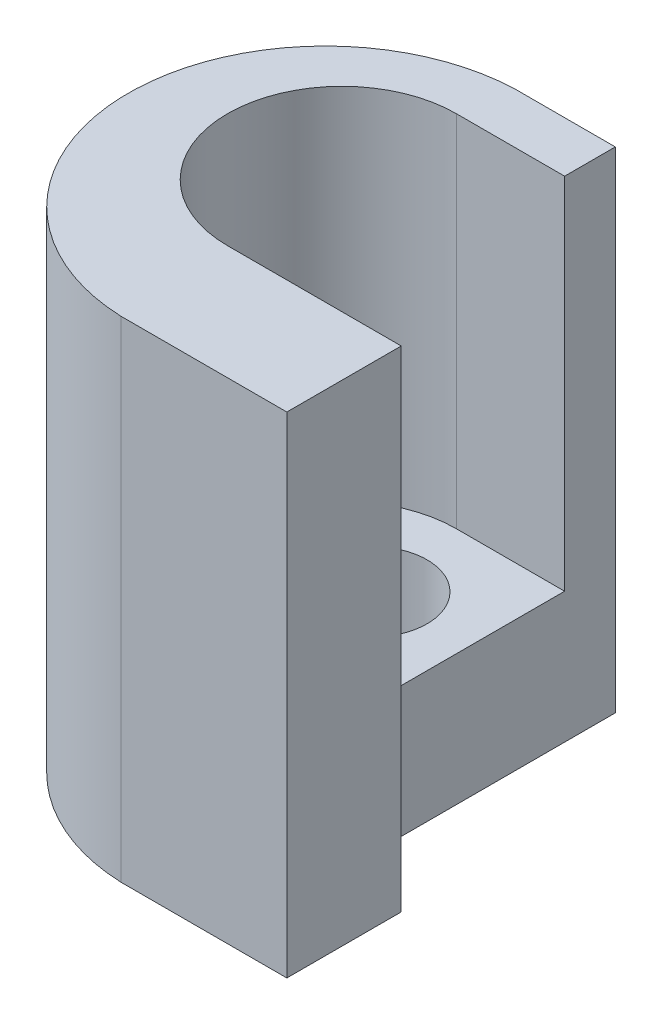
ISO-10303-21;
HEADER;
FILE_DESCRIPTION(('STEP AP214'),'2;1');
FILE_NAME('part.step','',(''),(''),'','','');
FILE_SCHEMA(('AUTOMOTIVE_DESIGN { 1 0 10303 214 1 1 1 1 }'));
ENDSEC;
DATA;
#1=APPLICATION_CONTEXT('core data for automotive mechanical design processes');
#2=APPLICATION_PROTOCOL_DEFINITION('international standard','automotive_design',2000,#1);
#3=PRODUCT_CONTEXT('',#1,'mechanical');
#4=PRODUCT('Part','Part','',(#3));
#5=PRODUCT_RELATED_PRODUCT_CATEGORY('part','',(#4));
#6=PRODUCT_DEFINITION_FORMATION('','',#4);
#7=PRODUCT_DEFINITION_CONTEXT('part definition',#1,'design');
#8=PRODUCT_DEFINITION('design','',#6,#7);
#9=PRODUCT_DEFINITION_SHAPE('','',#8);
#10=(LENGTH_UNIT() NAMED_UNIT(*) SI_UNIT(.MILLI.,.METRE.));
#11=(NAMED_UNIT(*) PLANE_ANGLE_UNIT() SI_UNIT($,.RADIAN.));
#12=(NAMED_UNIT(*) SI_UNIT($,.STERADIAN.) SOLID_ANGLE_UNIT());
#13=UNCERTAINTY_MEASURE_WITH_UNIT(LENGTH_MEASURE(1.E-05),#10,'distance_accuracy_value','');
#14=(GEOMETRIC_REPRESENTATION_CONTEXT(3) GLOBAL_UNCERTAINTY_ASSIGNED_CONTEXT((#13)) GLOBAL_UNIT_ASSIGNED_CONTEXT((#10,
#11,#12)) REPRESENTATION_CONTEXT('',''));
#15=CARTESIAN_POINT('',(0.,0.,0.));
#16=DIRECTION('',(0.,0.,1.));
#17=DIRECTION('',(1.,0.,0.));
#18=AXIS2_PLACEMENT_3D('',#15,#16,#17);
#19=CARTESIAN_POINT('',(-14.338233670593,4.,0.53336368));
#20=DIRECTION('',(0.,-1.,0.));
#21=DIRECTION('',(0.,0.,-1.));
#22=AXIS2_PLACEMENT_3D('',#19,#20,#21);
#23=PLANE('',#22);
#24=DIRECTION('',(-1.,0.,0.));
#25=VECTOR('',#24,1.);
#26=CARTESIAN_POINT('',(-14.338233670593,4.,-2.96663632));
#27=LINE('',#26,#25);
#28=CARTESIAN_POINT('',(-11.0234775688937,4.,-2.96663632));
#29=VERTEX_POINT('',#28);
#30=CARTESIAN_POINT('',(-14.338233670593,4.,-2.96663632));
#31=VERTEX_POINT('',#30);
#32=EDGE_CURVE('E148',#29,#31,#27,.T.);
#33=ORIENTED_EDGE('',*,*,#32,.T.);
#34=CARTESIAN_POINT('',(-14.338233670593,4.,0.53336368));
#35=DIRECTION('',(0.,1.,0.));
#36=DIRECTION('',(0.,0.,-1.));
#37=AXIS2_PLACEMENT_3D('',#34,#35,#36);
#38=CIRCLE('',#37,3.5);
#39=CARTESIAN_POINT('',(-14.338233670593,4.,4.03336368));
#40=VERTEX_POINT('',#39);
#41=EDGE_CURVE('E62',#31,#40,#38,.T.);
#42=ORIENTED_EDGE('',*,*,#41,.T.);
#43=DIRECTION('',(1.,0.,0.));
#44=VECTOR('',#43,1.);
#45=CARTESIAN_POINT('',(-11.0234775688937,4.,4.03336368));
#46=LINE('',#45,#44);
#47=CARTESIAN_POINT('',(-11.0234775688937,4.,4.03336368));
#48=VERTEX_POINT('',#47);
#49=EDGE_CURVE('E153',#40,#48,#46,.T.);
#50=ORIENTED_EDGE('',*,*,#49,.T.);
#51=DIRECTION('',(0.,0.,-1.));
#52=VECTOR('',#51,1.);
#53=CARTESIAN_POINT('',(-11.0234775688937,4.,-2.96663632));
#54=LINE('',#53,#52);
#55=EDGE_CURVE('E48',#48,#29,#54,.T.);
#56=ORIENTED_EDGE('',*,*,#55,.T.);
#57=EDGE_LOOP('',(#33,#42,#50,#56));
#58=FACE_BOUND('',#57,.T.);
#59=CARTESIAN_POINT('',(-13.9634775688937,4.,0.00336367999999949));
#60=DIRECTION('',(0.,1.,0.));
#61=DIRECTION('',(0.,0.,1.));
#62=AXIS2_PLACEMENT_3D('',#59,#60,#61);
#63=CIRCLE('',#62,1.7);
#64=CARTESIAN_POINT('',(-13.9634775688937,4.,1.70336368));
#65=VERTEX_POINT('',#64);
#66=EDGE_CURVE('E138',#65,#65,#63,.T.);
#67=ORIENTED_EDGE('',*,*,#66,.F.);
#68=EDGE_LOOP('',(#67));
#69=FACE_BOUND('',#68,.T.);
#70=ADVANCED_FACE('F39',(#58,#69),#23,.F.);
#71=CARTESIAN_POINT('',(-14.338233670593,0.,0.53336368));
#72=DIRECTION('',(0.,-1.,0.));
#73=DIRECTION('',(0.,0.,-1.));
#74=AXIS2_PLACEMENT_3D('',#71,#72,#73);
#75=PLANE('',#74);
#76=DIRECTION('',(-1.,0.,0.));
#77=VECTOR('',#76,1.);
#78=CARTESIAN_POINT('',(-11.0234775688937,0.,-4.51757177830843));
#79=LINE('',#78,#77);
#80=CARTESIAN_POINT('',(-11.0234775688937,0.,-4.51757177830843));
#81=VERTEX_POINT('',#80);
#82=CARTESIAN_POINT('',(-14.1034775688937,0.,-4.51757177830843));
#83=VERTEX_POINT('',#82);
#84=EDGE_CURVE('E171',#81,#83,#79,.T.);
#85=ORIENTED_EDGE('',*,*,#84,.F.);
#86=DIRECTION('',(0.,0.,-1.));
#87=VECTOR('',#86,1.);
#88=CARTESIAN_POINT('',(-11.0234775688937,0.,-2.96663632));
#89=LINE('',#88,#87);
#90=CARTESIAN_POINT('',(-11.0234775688937,0.,4.03336368));
#91=VERTEX_POINT('',#90);
#92=EDGE_CURVE('E146',#91,#81,#89,.T.);
#93=ORIENTED_EDGE('',*,*,#92,.F.);
#94=DIRECTION('',(-1.,0.,0.));
#95=VECTOR('',#94,1.);
#96=CARTESIAN_POINT('',(-14.338233670593,0.,4.03336368));
#97=LINE('',#96,#95);
#98=CARTESIAN_POINT('',(-9.02347756889374,0.,4.03336368));
#99=VERTEX_POINT('',#98);
#100=EDGE_CURVE('E55',#99,#91,#97,.T.);
#101=ORIENTED_EDGE('',*,*,#100,.F.);
#102=DIRECTION('',(0.,0.,-1.));
#103=VECTOR('',#102,1.);
#104=CARTESIAN_POINT('',(-9.02347756889374,0.,4.03336368));
#105=LINE('',#104,#103);
#106=CARTESIAN_POINT('',(-9.02347756889374,0.,7.53336368));
#107=VERTEX_POINT('',#106);
#108=EDGE_CURVE('E191',#107,#99,#105,.T.);
#109=ORIENTED_EDGE('',*,*,#108,.F.);
#110=DIRECTION('',(1.,0.,0.));
#111=VECTOR('',#110,1.);
#112=CARTESIAN_POINT('',(-9.02347756889374,0.,7.53336368));
#113=LINE('',#112,#111);
#114=CARTESIAN_POINT('',(-14.1034775688937,0.,7.53336368));
#115=VERTEX_POINT('',#114);
#116=EDGE_CURVE('E184',#115,#107,#113,.T.);
#117=ORIENTED_EDGE('',*,*,#116,.F.);
#118=CARTESIAN_POINT('',(-13.8697284621123,0.,1.50789595084578));
#119=DIRECTION('',(0.,1.,0.));
#120=DIRECTION('',(0.,0.,1.));
#121=AXIS2_PLACEMENT_3D('',#118,#119,#120);
#122=CIRCLE('',#121,6.03);
#123=EDGE_CURVE('E180',#83,#115,#122,.T.);
#124=ORIENTED_EDGE('',*,*,#123,.F.);
#125=EDGE_LOOP('',(#85,#93,#101,#109,#117,#124));
#126=FACE_BOUND('',#125,.T.);
#127=CARTESIAN_POINT('',(-13.9634775688937,0.,0.00336367999999949));
#128=DIRECTION('',(0.,1.,0.));
#129=DIRECTION('',(0.,0.,1.));
#130=AXIS2_PLACEMENT_3D('',#127,#128,#129);
#131=CIRCLE('',#130,1.7);
#132=CARTESIAN_POINT('',(-13.9634775688937,0.,1.70336368));
#133=VERTEX_POINT('',#132);
#134=EDGE_CURVE('E133',#133,#133,#131,.T.);
#135=ORIENTED_EDGE('',*,*,#134,.T.);
#136=EDGE_LOOP('',(#135));
#137=FACE_BOUND('',#136,.T.);
#138=ADVANCED_FACE('F177',(#126,#137),#75,.T.);
#139=CARTESIAN_POINT('',(-11.0234775688937,4.,-2.96663632));
#140=DIRECTION('',(-1.,0.,0.));
#141=DIRECTION('',(0.,0.,1.));
#142=AXIS2_PLACEMENT_3D('',#139,#140,#141);
#143=PLANE('',#142);
#144=ORIENTED_EDGE('',*,*,#92,.T.);
#145=DIRECTION('',(0.,-1.,0.));
#146=VECTOR('',#145,1.);
#147=CARTESIAN_POINT('',(-11.0234775688937,15.,-4.51757177830843));
#148=LINE('',#147,#146);
#149=CARTESIAN_POINT('',(-11.0234775688937,15.,-4.51757177830843));
#150=VERTEX_POINT('',#149);
#151=EDGE_CURVE('E140',#150,#81,#148,.T.);
#152=ORIENTED_EDGE('',*,*,#151,.F.);
#153=DIRECTION('',(0.,0.,-1.));
#154=VECTOR('',#153,1.);
#155=CARTESIAN_POINT('',(-11.0234775688937,15.,-2.96663632));
#156=LINE('',#155,#154);
#157=CARTESIAN_POINT('',(-11.0234775688937,15.,-2.96663632));
#158=VERTEX_POINT('',#157);
#159=EDGE_CURVE('E121',#158,#150,#156,.T.);
#160=ORIENTED_EDGE('',*,*,#159,.F.);
#161=DIRECTION('',(0.,-1.,0.));
#162=VECTOR('',#161,1.);
#163=CARTESIAN_POINT('',(-11.0234775688937,15.,-2.96663632));
#164=LINE('',#163,#162);
#165=EDGE_CURVE('E117',#158,#29,#164,.T.);
#166=ORIENTED_EDGE('',*,*,#165,.T.);
#167=ORIENTED_EDGE('',*,*,#55,.F.);
#168=DIRECTION('',(0.,-1.,0.));
#169=VECTOR('',#168,1.);
#170=CARTESIAN_POINT('',(-11.0234775688937,4.,4.03336368));
#171=LINE('',#170,#169);
#172=EDGE_CURVE('E11',#48,#91,#171,.T.);
#173=ORIENTED_EDGE('',*,*,#172,.T.);
#174=EDGE_LOOP('',(#144,#152,#160,#166,#167,#173));
#175=FACE_BOUND('',#174,.T.);
#176=ADVANCED_FACE('F41',(#175),#143,.F.);
#177=CARTESIAN_POINT('',(-13.9634775688937,4.,0.00336367999999949));
#178=DIRECTION('',(0.,-1.,0.));
#179=DIRECTION('',(0.,0.,-1.));
#180=AXIS2_PLACEMENT_3D('',#177,#178,#179);
#181=CYLINDRICAL_SURFACE('',#180,1.7);
#182=ORIENTED_EDGE('',*,*,#66,.T.);
#183=EDGE_LOOP('',(#182));
#184=FACE_BOUND('',#183,.T.);
#185=ORIENTED_EDGE('',*,*,#134,.F.);
#186=EDGE_LOOP('',(#185));
#187=FACE_BOUND('',#186,.T.);
#188=ADVANCED_FACE('F243',(#184,#187),#181,.F.);
#189=CARTESIAN_POINT('',(-14.338233670593,15.,0.53336368));
#190=DIRECTION('',(0.,-1.,0.));
#191=DIRECTION('',(0.,0.,-1.));
#192=AXIS2_PLACEMENT_3D('',#189,#190,#191);
#193=CYLINDRICAL_SURFACE('',#192,3.5);
#194=DIRECTION('',(0.,-1.,0.));
#195=VECTOR('',#194,1.);
#196=CARTESIAN_POINT('',(-14.338233670593,15.,4.03336368));
#197=LINE('',#196,#195);
#198=CARTESIAN_POINT('',(-14.338233670593,15.,4.03336368));
#199=VERTEX_POINT('',#198);
#200=EDGE_CURVE('E197',#199,#40,#197,.T.);
#201=ORIENTED_EDGE('',*,*,#200,.T.);
#202=ORIENTED_EDGE('',*,*,#41,.F.);
#203=DIRECTION('',(0.,-1.,0.));
#204=VECTOR('',#203,1.);
#205=CARTESIAN_POINT('',(-14.338233670593,15.,-2.96663632));
#206=LINE('',#205,#204);
#207=CARTESIAN_POINT('',(-14.338233670593,15.,-2.96663632));
#208=VERTEX_POINT('',#207);
#209=EDGE_CURVE('E114',#208,#31,#206,.T.);
#210=ORIENTED_EDGE('',*,*,#209,.F.);
#211=CARTESIAN_POINT('',(-14.338233670593,15.,0.53336368));
#212=DIRECTION('',(0.,-1.,0.));
#213=DIRECTION('',(0.,0.,1.));
#214=AXIS2_PLACEMENT_3D('',#211,#212,#213);
#215=CIRCLE('',#214,3.5);
#216=EDGE_CURVE('E122',#199,#208,#215,.T.);
#217=ORIENTED_EDGE('',*,*,#216,.F.);
#218=EDGE_LOOP('',(#201,#202,#210,#217));
#219=FACE_BOUND('',#218,.T.);
#220=ADVANCED_FACE('F131',(#219),#193,.F.);
#221=CARTESIAN_POINT('',(-11.0234775688937,15.,-2.96663632));
#222=DIRECTION('',(0.,0.,-1.));
#223=DIRECTION('',(-1.,0.,0.));
#224=AXIS2_PLACEMENT_3D('',#221,#222,#223);
#225=PLANE('',#224);
#226=ORIENTED_EDGE('',*,*,#209,.T.);
#227=ORIENTED_EDGE('',*,*,#32,.F.);
#228=ORIENTED_EDGE('',*,*,#165,.F.);
#229=DIRECTION('',(1.,0.,0.));
#230=VECTOR('',#229,1.);
#231=CARTESIAN_POINT('',(-11.0234775688937,15.,-2.96663632));
#232=LINE('',#231,#230);
#233=EDGE_CURVE('E111',#208,#158,#232,.T.);
#234=ORIENTED_EDGE('',*,*,#233,.F.);
#235=EDGE_LOOP('',(#226,#227,#228,#234));
#236=FACE_BOUND('',#235,.T.);
#237=ADVANCED_FACE('F113',(#236),#225,.F.);
#238=CARTESIAN_POINT('',(-14.338233670593,15.,4.03336368));
#239=DIRECTION('',(0.,0.,1.));
#240=DIRECTION('',(1.,0.,0.));
#241=AXIS2_PLACEMENT_3D('',#238,#239,#240);
#242=PLANE('',#241);
#243=ORIENTED_EDGE('',*,*,#172,.F.);
#244=ORIENTED_EDGE('',*,*,#49,.F.);
#245=ORIENTED_EDGE('',*,*,#200,.F.);
#246=DIRECTION('',(-1.,0.,0.));
#247=VECTOR('',#246,1.);
#248=CARTESIAN_POINT('',(-11.0234775688937,15.,4.03336368));
#249=LINE('',#248,#247);
#250=CARTESIAN_POINT('',(-9.02347756889374,15.,4.03336368));
#251=VERTEX_POINT('',#250);
#252=EDGE_CURVE('E127',#251,#199,#249,.T.);
#253=ORIENTED_EDGE('',*,*,#252,.F.);
#254=DIRECTION('',(0.,-1.,0.));
#255=VECTOR('',#254,1.);
#256=CARTESIAN_POINT('',(-9.02347756889374,15.,4.03336368));
#257=LINE('',#256,#255);
#258=EDGE_CURVE('E200',#251,#99,#257,.T.);
#259=ORIENTED_EDGE('',*,*,#258,.T.);
#260=ORIENTED_EDGE('',*,*,#100,.T.);
#261=EDGE_LOOP('',(#243,#244,#245,#253,#259,#260));
#262=FACE_BOUND('',#261,.T.);
#263=ADVANCED_FACE('F235',(#262),#242,.F.);
#264=CARTESIAN_POINT('',(-11.0234775688937,15.,-4.51757177830843));
#265=DIRECTION('',(0.,0.,1.));
#266=DIRECTION('',(1.,0.,0.));
#267=AXIS2_PLACEMENT_3D('',#264,#265,#266);
#268=PLANE('',#267);
#269=ORIENTED_EDGE('',*,*,#84,.T.);
#270=DIRECTION('',(0.,-1.,0.));
#271=VECTOR('',#270,1.);
#272=CARTESIAN_POINT('',(-14.1034775688937,15.,-4.51757177830843));
#273=LINE('',#272,#271);
#274=CARTESIAN_POINT('',(-14.1034775688937,15.,-4.51757177830843));
#275=VERTEX_POINT('',#274);
#276=EDGE_CURVE('E175',#275,#83,#273,.T.);
#277=ORIENTED_EDGE('',*,*,#276,.F.);
#278=DIRECTION('',(-1.,0.,0.));
#279=VECTOR('',#278,1.);
#280=CARTESIAN_POINT('',(-11.0234775688937,15.,-4.51757177830843));
#281=LINE('',#280,#279);
#282=EDGE_CURVE('E173',#150,#275,#281,.T.);
#283=ORIENTED_EDGE('',*,*,#282,.F.);
#284=ORIENTED_EDGE('',*,*,#151,.T.);
#285=EDGE_LOOP('',(#269,#277,#283,#284));
#286=FACE_BOUND('',#285,.T.);
#287=ADVANCED_FACE('F169',(#286),#268,.F.);
#288=CARTESIAN_POINT('',(-13.8697284621123,15.,1.50789595084578));
#289=DIRECTION('',(0.,-1.,0.));
#290=DIRECTION('',(0.,0.,-1.));
#291=AXIS2_PLACEMENT_3D('',#288,#289,#290);
#292=CYLINDRICAL_SURFACE('',#291,6.03);
#293=ORIENTED_EDGE('',*,*,#123,.T.);
#294=DIRECTION('',(0.,-1.,0.));
#295=VECTOR('',#294,1.);
#296=CARTESIAN_POINT('',(-14.1034775688937,15.,7.53336368));
#297=LINE('',#296,#295);
#298=CARTESIAN_POINT('',(-14.1034775688937,15.,7.53336368));
#299=VERTEX_POINT('',#298);
#300=EDGE_CURVE('E207',#299,#115,#297,.T.);
#301=ORIENTED_EDGE('',*,*,#300,.F.);
#302=CARTESIAN_POINT('',(-13.8697284621123,15.,1.50789595084578));
#303=DIRECTION('',(0.,1.,0.));
#304=DIRECTION('',(0.,0.,1.));
#305=AXIS2_PLACEMENT_3D('',#302,#303,#304);
#306=CIRCLE('',#305,6.03);
#307=EDGE_CURVE('E216',#275,#299,#306,.T.);
#308=ORIENTED_EDGE('',*,*,#307,.F.);
#309=ORIENTED_EDGE('',*,*,#276,.T.);
#310=EDGE_LOOP('',(#293,#301,#308,#309));
#311=FACE_BOUND('',#310,.T.);
#312=ADVANCED_FACE('F214',(#311),#292,.T.);
#313=CARTESIAN_POINT('',(-9.02347756889374,15.,7.53336368));
#314=DIRECTION('',(0.,0.,-1.));
#315=DIRECTION('',(-1.,0.,0.));
#316=AXIS2_PLACEMENT_3D('',#313,#314,#315);
#317=PLANE('',#316);
#318=ORIENTED_EDGE('',*,*,#116,.T.);
#319=DIRECTION('',(0.,-1.,0.));
#320=VECTOR('',#319,1.);
#321=CARTESIAN_POINT('',(-9.02347756889374,15.,7.53336368));
#322=LINE('',#321,#320);
#323=CARTESIAN_POINT('',(-9.02347756889374,15.,7.53336368));
#324=VERTEX_POINT('',#323);
#325=EDGE_CURVE('E203',#324,#107,#322,.T.);
#326=ORIENTED_EDGE('',*,*,#325,.F.);
#327=DIRECTION('',(1.,0.,0.));
#328=VECTOR('',#327,1.);
#329=CARTESIAN_POINT('',(-9.02347756889374,15.,7.53336368));
#330=LINE('',#329,#328);
#331=EDGE_CURVE('E219',#299,#324,#330,.T.);
#332=ORIENTED_EDGE('',*,*,#331,.F.);
#333=ORIENTED_EDGE('',*,*,#300,.T.);
#334=EDGE_LOOP('',(#318,#326,#332,#333));
#335=FACE_BOUND('',#334,.T.);
#336=ADVANCED_FACE('F261',(#335),#317,.F.);
#337=CARTESIAN_POINT('',(-9.02347756889374,15.,4.03336368));
#338=DIRECTION('',(-1.,0.,0.));
#339=DIRECTION('',(0.,0.,1.));
#340=AXIS2_PLACEMENT_3D('',#337,#338,#339);
#341=PLANE('',#340);
#342=ORIENTED_EDGE('',*,*,#108,.T.);
#343=ORIENTED_EDGE('',*,*,#258,.F.);
#344=DIRECTION('',(0.,0.,-1.));
#345=VECTOR('',#344,1.);
#346=CARTESIAN_POINT('',(-9.02347756889374,15.,4.03336368));
#347=LINE('',#346,#345);
#348=EDGE_CURVE('E223',#324,#251,#347,.T.);
#349=ORIENTED_EDGE('',*,*,#348,.F.);
#350=ORIENTED_EDGE('',*,*,#325,.T.);
#351=EDGE_LOOP('',(#342,#343,#349,#350));
#352=FACE_BOUND('',#351,.T.);
#353=ADVANCED_FACE('F233',(#352),#341,.F.);
#354=CARTESIAN_POINT('',(-14.338233670593,15.,0.53336368));
#355=DIRECTION('',(0.,1.,0.));
#356=DIRECTION('',(0.,0.,1.));
#357=AXIS2_PLACEMENT_3D('',#354,#355,#356);
#358=PLANE('',#357);
#359=ORIENTED_EDGE('',*,*,#216,.T.);
#360=ORIENTED_EDGE('',*,*,#233,.T.);
#361=ORIENTED_EDGE('',*,*,#159,.T.);
#362=ORIENTED_EDGE('',*,*,#282,.T.);
#363=ORIENTED_EDGE('',*,*,#307,.T.);
#364=ORIENTED_EDGE('',*,*,#331,.T.);
#365=ORIENTED_EDGE('',*,*,#348,.T.);
#366=ORIENTED_EDGE('',*,*,#252,.T.);
#367=EDGE_LOOP('',(#359,#360,#361,#362,#363,#364,#365,#366));
#368=FACE_BOUND('',#367,.T.);
#369=ADVANCED_FACE('F125',(#368),#358,.T.);
#370=CLOSED_SHELL('',(#70,#138,#176,#188,#220,#237,#263,#287,#312,#336,#353,#369));
#371=MANIFOLD_SOLID_BREP('B2',#370);
#372=ADVANCED_BREP_SHAPE_REPRESENTATION('',(#18,#371),#14);
#373=SHAPE_DEFINITION_REPRESENTATION(#9,#372);
ENDSEC;
END-ISO-10303-21;
